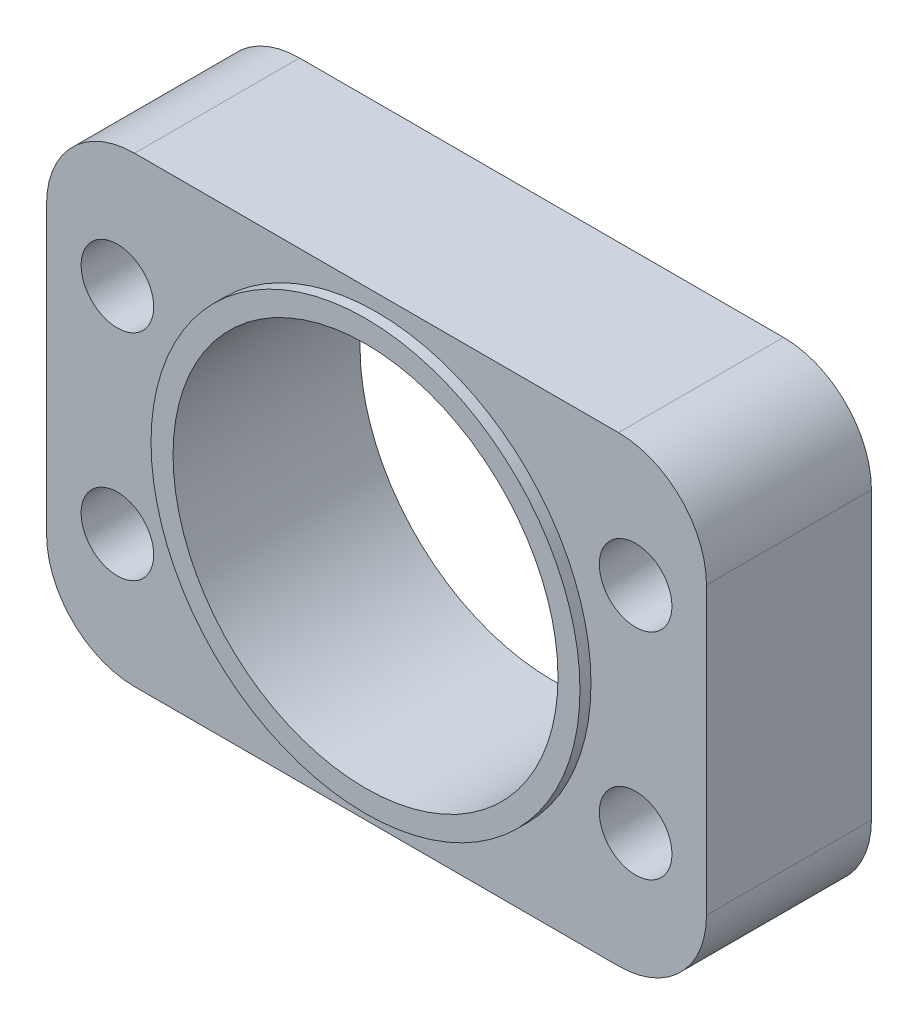
ISO-10303-21;
HEADER;
FILE_DESCRIPTION(('STEP AP214'),'2;1');
FILE_NAME('part.step','',(''),(''),'','','');
FILE_SCHEMA(('AUTOMOTIVE_DESIGN { 1 0 10303 214 1 1 1 1 }'));
ENDSEC;
DATA;
#1=APPLICATION_CONTEXT('core data for automotive mechanical design processes');
#2=APPLICATION_PROTOCOL_DEFINITION('international standard','automotive_design',2000,#1);
#3=PRODUCT_CONTEXT('',#1,'mechanical');
#4=PRODUCT('Part','Part','',(#3));
#5=PRODUCT_RELATED_PRODUCT_CATEGORY('part','',(#4));
#6=PRODUCT_DEFINITION_FORMATION('','',#4);
#7=PRODUCT_DEFINITION_CONTEXT('part definition',#1,'design');
#8=PRODUCT_DEFINITION('design','',#6,#7);
#9=PRODUCT_DEFINITION_SHAPE('','',#8);
#10=(LENGTH_UNIT() NAMED_UNIT(*) SI_UNIT(.MILLI.,.METRE.));
#11=(NAMED_UNIT(*) PLANE_ANGLE_UNIT() SI_UNIT($,.RADIAN.));
#12=(NAMED_UNIT(*) SI_UNIT($,.STERADIAN.) SOLID_ANGLE_UNIT());
#13=UNCERTAINTY_MEASURE_WITH_UNIT(LENGTH_MEASURE(1.E-05),#10,'distance_accuracy_value','');
#14=(GEOMETRIC_REPRESENTATION_CONTEXT(3) GLOBAL_UNCERTAINTY_ASSIGNED_CONTEXT((#13)) GLOBAL_UNIT_ASSIGNED_CONTEXT((#10,
#11,#12)) REPRESENTATION_CONTEXT('',''));
#15=CARTESIAN_POINT('',(0.,0.,0.));
#16=DIRECTION('',(0.,0.,1.));
#17=DIRECTION('',(1.,0.,0.));
#18=AXIS2_PLACEMENT_3D('',#15,#16,#17);
#19=CARTESIAN_POINT('',(-21.9999999999987,12.9999999999987,-15.));
#20=DIRECTION('',(0.,0.,1.));
#21=DIRECTION('',(-1.62475418465166E-13,1.,0.));
#22=AXIS2_PLACEMENT_3D('',#19,#20,#21);
#23=CYLINDRICAL_SURFACE('',#22,8.0000000000013);
#24=CARTESIAN_POINT('',(-21.9999999999987,12.9999999999987,0.));
#25=DIRECTION('',(0.,0.,-1.));
#26=DIRECTION('',(-1.,1.62536650805096E-13,0.));
#27=AXIS2_PLACEMENT_3D('',#24,#25,#26);
#28=CIRCLE('',#27,8.0000000000013);
#29=CARTESIAN_POINT('',(-22.,21.,0.));
#30=VERTEX_POINT('',#29);
#31=CARTESIAN_POINT('',(-30.,13.,0.));
#32=VERTEX_POINT('',#31);
#33=EDGE_CURVE('E83',#30,#32,#28,.F.);
#34=ORIENTED_EDGE('',*,*,#33,.F.);
#35=DIRECTION('',(0.,0.,-1.));
#36=VECTOR('',#35,1.);
#37=CARTESIAN_POINT('',(-22.,21.,0.));
#38=LINE('',#37,#36);
#39=CARTESIAN_POINT('',(-22.,21.,-15.));
#40=VERTEX_POINT('',#39);
#41=EDGE_CURVE('E95',#40,#30,#38,.F.);
#42=ORIENTED_EDGE('',*,*,#41,.F.);
#43=CARTESIAN_POINT('',(-21.9999999999987,12.9999999999987,-15.));
#44=DIRECTION('',(0.,0.,1.));
#45=DIRECTION('',(-1.62536650805096E-13,1.,0.));
#46=AXIS2_PLACEMENT_3D('',#43,#44,#45);
#47=CIRCLE('',#46,8.0000000000013);
#48=CARTESIAN_POINT('',(-30.,13.,-15.));
#49=VERTEX_POINT('',#48);
#50=EDGE_CURVE('E100',#40,#49,#47,.T.);
#51=ORIENTED_EDGE('',*,*,#50,.T.);
#52=DIRECTION('',(0.,0.,1.));
#53=VECTOR('',#52,1.);
#54=CARTESIAN_POINT('',(-30.,13.,-15.));
#55=LINE('',#54,#53);
#56=EDGE_CURVE('E97',#49,#32,#55,.T.);
#57=ORIENTED_EDGE('',*,*,#56,.T.);
#58=EDGE_LOOP('',(#34,#42,#51,#57));
#59=FACE_BOUND('',#58,.T.);
#60=ADVANCED_FACE('F17',(#59),#23,.T.);
#61=CARTESIAN_POINT('',(-30.,-13.,-15.));
#62=DIRECTION('',(-1.,0.,0.));
#63=DIRECTION('',(0.,0.,1.));
#64=AXIS2_PLACEMENT_3D('',#61,#62,#63);
#65=PLANE('',#64);
#66=DIRECTION('',(0.,1.,0.));
#67=VECTOR('',#66,1.);
#68=CARTESIAN_POINT('',(-30.,-13.,0.));
#69=LINE('',#68,#67);
#70=CARTESIAN_POINT('',(-30.,-13.,0.));
#71=VERTEX_POINT('',#70);
#72=EDGE_CURVE('E111',#32,#71,#69,.F.);
#73=ORIENTED_EDGE('',*,*,#72,.F.);
#74=ORIENTED_EDGE('',*,*,#56,.F.);
#75=DIRECTION('',(0.,-1.,0.));
#76=VECTOR('',#75,1.);
#77=CARTESIAN_POINT('',(-30.,13.,-15.));
#78=LINE('',#77,#76);
#79=CARTESIAN_POINT('',(-30.,-13.,-15.));
#80=VERTEX_POINT('',#79);
#81=EDGE_CURVE('E115',#49,#80,#78,.T.);
#82=ORIENTED_EDGE('',*,*,#81,.T.);
#83=DIRECTION('',(0.,0.,1.));
#84=VECTOR('',#83,1.);
#85=CARTESIAN_POINT('',(-30.,-13.,-15.));
#86=LINE('',#85,#84);
#87=EDGE_CURVE('E120',#80,#71,#86,.T.);
#88=ORIENTED_EDGE('',*,*,#87,.T.);
#89=EDGE_LOOP('',(#73,#74,#82,#88));
#90=FACE_BOUND('',#89,.T.);
#91=ADVANCED_FACE('F263',(#90),#65,.T.);
#92=CARTESIAN_POINT('',(-21.9999999999987,-12.9999999999987,-15.));
#93=DIRECTION('',(0.,0.,1.));
#94=DIRECTION('',(-1.,-1.61526007705508E-13,0.));
#95=AXIS2_PLACEMENT_3D('',#92,#93,#94);
#96=CYLINDRICAL_SURFACE('',#95,8.0000000000013);
#97=CARTESIAN_POINT('',(-21.9999999999987,-12.9999999999987,0.));
#98=DIRECTION('',(0.,0.,-1.));
#99=DIRECTION('',(-1.62536650805096E-13,-1.,0.));
#100=AXIS2_PLACEMENT_3D('',#97,#98,#99);
#101=CIRCLE('',#100,8.0000000000013);
#102=CARTESIAN_POINT('',(-22.,-21.,0.));
#103=VERTEX_POINT('',#102);
#104=EDGE_CURVE('E125',#71,#103,#101,.F.);
#105=ORIENTED_EDGE('',*,*,#104,.F.);
#106=ORIENTED_EDGE('',*,*,#87,.F.);
#107=CARTESIAN_POINT('',(-21.9999999999987,-12.9999999999987,-15.));
#108=DIRECTION('',(0.,0.,1.));
#109=DIRECTION('',(-1.,-1.61426427780472E-13,0.));
#110=AXIS2_PLACEMENT_3D('',#107,#108,#109);
#111=CIRCLE('',#110,8.0000000000013);
#112=CARTESIAN_POINT('',(-22.,-21.,-15.));
#113=VERTEX_POINT('',#112);
#114=EDGE_CURVE('E129',#80,#113,#111,.T.);
#115=ORIENTED_EDGE('',*,*,#114,.T.);
#116=DIRECTION('',(0.,0.,1.));
#117=VECTOR('',#116,1.);
#118=CARTESIAN_POINT('',(-22.,-21.,-15.));
#119=LINE('',#118,#117);
#120=EDGE_CURVE('E134',#113,#103,#119,.T.);
#121=ORIENTED_EDGE('',*,*,#120,.T.);
#122=EDGE_LOOP('',(#105,#106,#115,#121));
#123=FACE_BOUND('',#122,.T.);
#124=ADVANCED_FACE('F268',(#123),#96,.T.);
#125=CARTESIAN_POINT('',(-22.,-21.,0.));
#126=DIRECTION('',(0.,-1.,0.));
#127=DIRECTION('',(0.,0.,-1.));
#128=AXIS2_PLACEMENT_3D('',#125,#126,#127);
#129=PLANE('',#128);
#130=DIRECTION('',(-1.,0.,0.));
#131=VECTOR('',#130,1.);
#132=CARTESIAN_POINT('',(22.,-21.,0.));
#133=LINE('',#132,#131);
#134=CARTESIAN_POINT('',(22.,-21.,0.));
#135=VERTEX_POINT('',#134);
#136=EDGE_CURVE('E139',#103,#135,#133,.F.);
#137=ORIENTED_EDGE('',*,*,#136,.F.);
#138=ORIENTED_EDGE('',*,*,#120,.F.);
#139=DIRECTION('',(1.,0.,0.));
#140=VECTOR('',#139,1.);
#141=CARTESIAN_POINT('',(-22.,-21.,-15.));
#142=LINE('',#141,#140);
#143=CARTESIAN_POINT('',(22.,-21.,-15.));
#144=VERTEX_POINT('',#143);
#145=EDGE_CURVE('E143',#113,#144,#142,.T.);
#146=ORIENTED_EDGE('',*,*,#145,.T.);
#147=DIRECTION('',(0.,0.,1.));
#148=VECTOR('',#147,1.);
#149=CARTESIAN_POINT('',(22.,-21.,-15.));
#150=LINE('',#149,#148);
#151=EDGE_CURVE('E148',#144,#135,#150,.T.);
#152=ORIENTED_EDGE('',*,*,#151,.T.);
#153=EDGE_LOOP('',(#137,#138,#146,#152));
#154=FACE_BOUND('',#153,.T.);
#155=ADVANCED_FACE('F274',(#154),#129,.T.);
#156=CARTESIAN_POINT('',(21.9999999999987,-12.9999999999987,-15.));
#157=DIRECTION('',(0.,0.,1.));
#158=DIRECTION('',(1.62352953785251E-13,-1.,0.));
#159=AXIS2_PLACEMENT_3D('',#156,#157,#158);
#160=CYLINDRICAL_SURFACE('',#159,8.0000000000013);
#161=CARTESIAN_POINT('',(21.9999999999987,-12.9999999999987,0.));
#162=DIRECTION('',(0.,0.,-1.));
#163=DIRECTION('',(1.,0.,0.));
#164=AXIS2_PLACEMENT_3D('',#161,#162,#163);
#165=CIRCLE('',#164,8.0000000000013);
#166=CARTESIAN_POINT('',(30.,-12.9999999999993,0.));
#167=VERTEX_POINT('',#166);
#168=EDGE_CURVE('E153',#135,#167,#165,.F.);
#169=ORIENTED_EDGE('',*,*,#168,.F.);
#170=ORIENTED_EDGE('',*,*,#151,.F.);
#171=CARTESIAN_POINT('',(21.9999999999987,-12.9999999999987,-15.));
#172=DIRECTION('',(0.,0.,1.));
#173=DIRECTION('',(1.62536650805096E-13,-1.,0.));
#174=AXIS2_PLACEMENT_3D('',#171,#172,#173);
#175=CIRCLE('',#174,8.0000000000013);
#176=CARTESIAN_POINT('',(30.,-12.9999999999992,-15.));
#177=VERTEX_POINT('',#176);
#178=EDGE_CURVE('E157',#144,#177,#175,.T.);
#179=ORIENTED_EDGE('',*,*,#178,.T.);
#180=DIRECTION('',(0.,0.,1.));
#181=VECTOR('',#180,1.);
#182=CARTESIAN_POINT('',(30.,-12.9999999999992,-15.));
#183=LINE('',#182,#181);
#184=EDGE_CURVE('E162',#177,#167,#183,.T.);
#185=ORIENTED_EDGE('',*,*,#184,.T.);
#186=EDGE_LOOP('',(#169,#170,#179,#185));
#187=FACE_BOUND('',#186,.T.);
#188=ADVANCED_FACE('F278',(#187),#160,.T.);
#189=CARTESIAN_POINT('',(30.,-12.9999999999993,0.));
#190=DIRECTION('',(1.,0.,0.));
#191=DIRECTION('',(0.,0.,-1.));
#192=AXIS2_PLACEMENT_3D('',#189,#190,#191);
#193=PLANE('',#192);
#194=DIRECTION('',(0.,-1.,0.));
#195=VECTOR('',#194,1.);
#196=CARTESIAN_POINT('',(30.,12.9999999999998,0.));
#197=LINE('',#196,#195);
#198=CARTESIAN_POINT('',(30.,12.9999999999998,0.));
#199=VERTEX_POINT('',#198);
#200=EDGE_CURVE('E167',#167,#199,#197,.F.);
#201=ORIENTED_EDGE('',*,*,#200,.F.);
#202=ORIENTED_EDGE('',*,*,#184,.F.);
#203=DIRECTION('',(0.,1.,0.));
#204=VECTOR('',#203,1.);
#205=CARTESIAN_POINT('',(30.,-12.9999999999992,-15.));
#206=LINE('',#205,#204);
#207=CARTESIAN_POINT('',(30.,12.9999999999998,-15.));
#208=VERTEX_POINT('',#207);
#209=EDGE_CURVE('E171',#177,#208,#206,.T.);
#210=ORIENTED_EDGE('',*,*,#209,.T.);
#211=DIRECTION('',(0.,0.,1.));
#212=VECTOR('',#211,1.);
#213=CARTESIAN_POINT('',(30.,12.9999999999998,-15.));
#214=LINE('',#213,#212);
#215=EDGE_CURVE('E176',#208,#199,#214,.T.);
#216=ORIENTED_EDGE('',*,*,#215,.T.);
#217=EDGE_LOOP('',(#201,#202,#210,#216));
#218=FACE_BOUND('',#217,.T.);
#219=ADVANCED_FACE('F282',(#218),#193,.T.);
#220=CARTESIAN_POINT('',(21.9999999999987,12.9999999999987,-15.));
#221=DIRECTION('',(0.,0.,1.));
#222=DIRECTION('',(1.,0.,0.));
#223=AXIS2_PLACEMENT_3D('',#220,#221,#222);
#224=CYLINDRICAL_SURFACE('',#223,8.0000000000013);
#225=CARTESIAN_POINT('',(21.9999999999987,12.9999999999987,0.));
#226=DIRECTION('',(0.,0.,-1.));
#227=DIRECTION('',(1.62092561595247E-13,1.,0.));
#228=AXIS2_PLACEMENT_3D('',#225,#226,#227);
#229=CIRCLE('',#228,8.0000000000013);
#230=CARTESIAN_POINT('',(22.,21.,0.));
#231=VERTEX_POINT('',#230);
#232=EDGE_CURVE('E32',#199,#231,#229,.F.);
#233=ORIENTED_EDGE('',*,*,#232,.F.);
#234=ORIENTED_EDGE('',*,*,#215,.F.);
#235=CARTESIAN_POINT('',(21.9999999999987,12.9999999999987,-15.));
#236=DIRECTION('',(0.,0.,1.));
#237=DIRECTION('',(1.,1.38333788868272E-13,0.));
#238=AXIS2_PLACEMENT_3D('',#235,#236,#237);
#239=CIRCLE('',#238,8.0000000000013);
#240=CARTESIAN_POINT('',(22.,21.,-15.));
#241=VERTEX_POINT('',#240);
#242=EDGE_CURVE('E184',#208,#241,#239,.T.);
#243=ORIENTED_EDGE('',*,*,#242,.T.);
#244=DIRECTION('',(0.,0.,1.));
#245=VECTOR('',#244,1.);
#246=CARTESIAN_POINT('',(22.,21.,-15.));
#247=LINE('',#246,#245);
#248=EDGE_CURVE('E89',#241,#231,#247,.T.);
#249=ORIENTED_EDGE('',*,*,#248,.T.);
#250=EDGE_LOOP('',(#233,#234,#243,#249));
#251=FACE_BOUND('',#250,.T.);
#252=ADVANCED_FACE('F286',(#251),#224,.T.);
#253=CARTESIAN_POINT('',(-22.,21.,-15.));
#254=DIRECTION('',(0.,1.,0.));
#255=DIRECTION('',(0.,0.,1.));
#256=AXIS2_PLACEMENT_3D('',#253,#254,#255);
#257=PLANE('',#256);
#258=DIRECTION('',(1.,0.,0.));
#259=VECTOR('',#258,1.);
#260=CARTESIAN_POINT('',(-22.,21.,0.));
#261=LINE('',#260,#259);
#262=EDGE_CURVE('E79',#231,#30,#261,.F.);
#263=ORIENTED_EDGE('',*,*,#262,.F.);
#264=ORIENTED_EDGE('',*,*,#248,.F.);
#265=DIRECTION('',(-1.,0.,0.));
#266=VECTOR('',#265,1.);
#267=CARTESIAN_POINT('',(22.,21.,-15.));
#268=LINE('',#267,#266);
#269=EDGE_CURVE('E40',#241,#40,#268,.T.);
#270=ORIENTED_EDGE('',*,*,#269,.T.);
#271=ORIENTED_EDGE('',*,*,#41,.T.);
#272=EDGE_LOOP('',(#263,#264,#270,#271));
#273=FACE_BOUND('',#272,.T.);
#274=ADVANCED_FACE('F99',(#273),#257,.T.);
#275=CARTESIAN_POINT('',(-30.,-21.,-15.));
#276=DIRECTION('',(0.,0.,-1.));
#277=DIRECTION('',(0.,1.,0.));
#278=AXIS2_PLACEMENT_3D('',#275,#276,#277);
#279=PLANE('',#278);
#280=ORIENTED_EDGE('',*,*,#50,.F.);
#281=ORIENTED_EDGE('',*,*,#269,.F.);
#282=ORIENTED_EDGE('',*,*,#242,.F.);
#283=ORIENTED_EDGE('',*,*,#209,.F.);
#284=ORIENTED_EDGE('',*,*,#178,.F.);
#285=ORIENTED_EDGE('',*,*,#145,.F.);
#286=ORIENTED_EDGE('',*,*,#114,.F.);
#287=ORIENTED_EDGE('',*,*,#81,.F.);
#288=EDGE_LOOP('',(#280,#281,#282,#283,#284,#285,#286,#287));
#289=FACE_BOUND('',#288,.T.);
#290=CARTESIAN_POINT('',(0.,0.,-15.));
#291=DIRECTION('',(0.,0.,1.));
#292=DIRECTION('',(-1.,0.,0.));
#293=AXIS2_PLACEMENT_3D('',#290,#291,#292);
#294=CIRCLE('',#293,19.5);
#295=CARTESIAN_POINT('',(-19.5,0.,-15.));
#296=VERTEX_POINT('',#295);
#297=EDGE_CURVE('E196',#296,#296,#294,.T.);
#298=ORIENTED_EDGE('',*,*,#297,.T.);
#299=EDGE_LOOP('',(#298));
#300=FACE_BOUND('',#299,.T.);
#301=CARTESIAN_POINT('',(-23.558928079038,9.7584275253098,-15.));
#302=DIRECTION('',(0.,0.,1.));
#303=DIRECTION('',(-1.,0.,0.));
#304=AXIS2_PLACEMENT_3D('',#301,#302,#303);
#305=CIRCLE('',#304,3.3);
#306=CARTESIAN_POINT('',(-26.858928079038,9.75842752530981,-15.));
#307=VERTEX_POINT('',#306);
#308=EDGE_CURVE('E201',#307,#307,#305,.T.);
#309=ORIENTED_EDGE('',*,*,#308,.T.);
#310=EDGE_LOOP('',(#309));
#311=FACE_BOUND('',#310,.T.);
#312=CARTESIAN_POINT('',(23.558928079038,9.7584275253098,-15.));
#313=DIRECTION('',(0.,0.,1.));
#314=DIRECTION('',(-1.,0.,0.));
#315=AXIS2_PLACEMENT_3D('',#312,#313,#314);
#316=CIRCLE('',#315,3.3);
#317=CARTESIAN_POINT('',(20.258928079038,9.75842752530981,-15.));
#318=VERTEX_POINT('',#317);
#319=EDGE_CURVE('E204',#318,#318,#316,.T.);
#320=ORIENTED_EDGE('',*,*,#319,.T.);
#321=EDGE_LOOP('',(#320));
#322=FACE_BOUND('',#321,.T.);
#323=CARTESIAN_POINT('',(23.558928079038,-9.7584275253098,-15.));
#324=DIRECTION('',(0.,0.,1.));
#325=DIRECTION('',(-1.,0.,0.));
#326=AXIS2_PLACEMENT_3D('',#323,#324,#325);
#327=CIRCLE('',#326,3.3);
#328=CARTESIAN_POINT('',(20.258928079038,-9.7584275253098,-15.));
#329=VERTEX_POINT('',#328);
#330=EDGE_CURVE('E207',#329,#329,#327,.T.);
#331=ORIENTED_EDGE('',*,*,#330,.T.);
#332=EDGE_LOOP('',(#331));
#333=FACE_BOUND('',#332,.T.);
#334=CARTESIAN_POINT('',(-23.558928079038,-9.7584275253098,-15.));
#335=DIRECTION('',(0.,0.,1.));
#336=DIRECTION('',(-1.,0.,0.));
#337=AXIS2_PLACEMENT_3D('',#334,#335,#336);
#338=CIRCLE('',#337,3.3);
#339=CARTESIAN_POINT('',(-26.858928079038,-9.7584275253098,-15.));
#340=VERTEX_POINT('',#339);
#341=EDGE_CURVE('E210',#340,#340,#338,.T.);
#342=ORIENTED_EDGE('',*,*,#341,.T.);
#343=EDGE_LOOP('',(#342));
#344=FACE_BOUND('',#343,.T.);
#345=ADVANCED_FACE('F293',(#289,#300,#311,#322,#333,#344),#279,.T.);
#346=CARTESIAN_POINT('',(-30.,-21.,0.));
#347=DIRECTION('',(0.,0.,1.));
#348=DIRECTION('',(1.,0.,0.));
#349=AXIS2_PLACEMENT_3D('',#346,#347,#348);
#350=PLANE('',#349);
#351=ORIENTED_EDGE('',*,*,#33,.T.);
#352=ORIENTED_EDGE('',*,*,#72,.T.);
#353=ORIENTED_EDGE('',*,*,#104,.T.);
#354=ORIENTED_EDGE('',*,*,#136,.T.);
#355=ORIENTED_EDGE('',*,*,#168,.T.);
#356=ORIENTED_EDGE('',*,*,#200,.T.);
#357=ORIENTED_EDGE('',*,*,#232,.T.);
#358=ORIENTED_EDGE('',*,*,#262,.T.);
#359=EDGE_LOOP('',(#351,#352,#353,#354,#355,#356,#357,#358));
#360=FACE_BOUND('',#359,.T.);
#361=CARTESIAN_POINT('',(0.,0.,0.));
#362=DIRECTION('',(0.,0.,-1.));
#363=DIRECTION('',(1.,-1.16832847669894E-09,0.));
#364=AXIS2_PLACEMENT_3D('',#361,#362,#363);
#365=CIRCLE('',#364,19.5);
#366=CARTESIAN_POINT('',(19.5,-2.27824052956294E-08,0.));
#367=VERTEX_POINT('',#366);
#368=EDGE_CURVE('E213',#367,#367,#365,.F.);
#369=ORIENTED_EDGE('',*,*,#368,.F.);
#370=EDGE_LOOP('',(#369));
#371=FACE_BOUND('',#370,.T.);
#372=CARTESIAN_POINT('',(-23.558928079038,9.7584275253098,0.));
#373=DIRECTION('',(0.,0.,-1.));
#374=DIRECTION('',(1.,0.,0.));
#375=AXIS2_PLACEMENT_3D('',#372,#373,#374);
#376=CIRCLE('',#375,3.3);
#377=CARTESIAN_POINT('',(-20.258928079038,9.75842752530979,0.));
#378=VERTEX_POINT('',#377);
#379=EDGE_CURVE('E216',#378,#378,#376,.F.);
#380=ORIENTED_EDGE('',*,*,#379,.F.);
#381=EDGE_LOOP('',(#380));
#382=FACE_BOUND('',#381,.T.);
#383=CARTESIAN_POINT('',(23.558928079038,9.7584275253098,0.));
#384=DIRECTION('',(0.,0.,-1.));
#385=DIRECTION('',(1.,0.,0.));
#386=AXIS2_PLACEMENT_3D('',#383,#384,#385);
#387=CIRCLE('',#386,3.3);
#388=CARTESIAN_POINT('',(26.858928079038,9.75842752530979,0.));
#389=VERTEX_POINT('',#388);
#390=EDGE_CURVE('E219',#389,#389,#387,.F.);
#391=ORIENTED_EDGE('',*,*,#390,.F.);
#392=EDGE_LOOP('',(#391));
#393=FACE_BOUND('',#392,.T.);
#394=CARTESIAN_POINT('',(23.558928079038,-9.7584275253098,0.));
#395=DIRECTION('',(0.,0.,-1.));
#396=DIRECTION('',(1.,0.,0.));
#397=AXIS2_PLACEMENT_3D('',#394,#395,#396);
#398=CIRCLE('',#397,3.3);
#399=CARTESIAN_POINT('',(26.858928079038,-9.7584275253098,0.));
#400=VERTEX_POINT('',#399);
#401=EDGE_CURVE('E222',#400,#400,#398,.F.);
#402=ORIENTED_EDGE('',*,*,#401,.F.);
#403=EDGE_LOOP('',(#402));
#404=FACE_BOUND('',#403,.T.);
#405=CARTESIAN_POINT('',(-23.558928079038,-9.7584275253098,0.));
#406=DIRECTION('',(0.,0.,-1.));
#407=DIRECTION('',(1.,0.,0.));
#408=AXIS2_PLACEMENT_3D('',#405,#406,#407);
#409=CIRCLE('',#408,3.3);
#410=CARTESIAN_POINT('',(-20.258928079038,-9.7584275253098,0.));
#411=VERTEX_POINT('',#410);
#412=EDGE_CURVE('E225',#411,#411,#409,.F.);
#413=ORIENTED_EDGE('',*,*,#412,.F.);
#414=EDGE_LOOP('',(#413));
#415=FACE_BOUND('',#414,.T.);
#416=ADVANCED_FACE('F81',(#360,#371,#382,#393,#404,#415),#350,.T.);
#417=CARTESIAN_POINT('',(-19.5,-19.8622387029843,1.));
#418=DIRECTION('',(0.,0.,1.));
#419=DIRECTION('',(1.,0.,0.));
#420=AXIS2_PLACEMENT_3D('',#417,#418,#419);
#421=PLANE('',#420);
#422=CARTESIAN_POINT('',(0.,0.,1.));
#423=DIRECTION('',(0.,0.,1.));
#424=DIRECTION('',(-1.,0.,0.));
#425=AXIS2_PLACEMENT_3D('',#422,#423,#424);
#426=CIRCLE('',#425,19.5);
#427=CARTESIAN_POINT('',(-19.5,0.,1.));
#428=VERTEX_POINT('',#427);
#429=EDGE_CURVE('E228',#428,#428,#426,.T.);
#430=ORIENTED_EDGE('',*,*,#429,.T.);
#431=EDGE_LOOP('',(#430));
#432=FACE_BOUND('',#431,.T.);
#433=CARTESIAN_POINT('',(0.,0.,1.));
#434=DIRECTION('',(0.,0.,-1.));
#435=DIRECTION('',(1.,0.,0.));
#436=AXIS2_PLACEMENT_3D('',#433,#434,#435);
#437=CIRCLE('',#436,17.5);
#438=CARTESIAN_POINT('',(17.5,0.,1.));
#439=VERTEX_POINT('',#438);
#440=EDGE_CURVE('E231',#439,#439,#437,.F.);
#441=ORIENTED_EDGE('',*,*,#440,.F.);
#442=EDGE_LOOP('',(#441));
#443=FACE_BOUND('',#442,.T.);
#444=ADVANCED_FACE('F242',(#432,#443),#421,.T.);
#445=CARTESIAN_POINT('',(-19.5,-19.8622386915074,-16.));
#446=DIRECTION('',(0.,0.,-1.));
#447=DIRECTION('',(0.,1.,0.));
#448=AXIS2_PLACEMENT_3D('',#445,#446,#447);
#449=PLANE('',#448);
#450=CARTESIAN_POINT('',(0.,0.,-16.));
#451=DIRECTION('',(0.,0.,-1.));
#452=DIRECTION('',(1.,0.,0.));
#453=AXIS2_PLACEMENT_3D('',#450,#451,#452);
#454=CIRCLE('',#453,19.5);
#455=CARTESIAN_POINT('',(19.5,0.,-16.));
#456=VERTEX_POINT('',#455);
#457=EDGE_CURVE('E25',#456,#456,#454,.F.);
#458=ORIENTED_EDGE('',*,*,#457,.F.);
#459=EDGE_LOOP('',(#458));
#460=FACE_BOUND('',#459,.T.);
#461=CARTESIAN_POINT('',(0.,0.,-16.));
#462=DIRECTION('',(0.,0.,1.));
#463=DIRECTION('',(-1.,0.,0.));
#464=AXIS2_PLACEMENT_3D('',#461,#462,#463);
#465=CIRCLE('',#464,17.5);
#466=CARTESIAN_POINT('',(-17.5,0.,-16.));
#467=VERTEX_POINT('',#466);
#468=EDGE_CURVE('E11',#467,#467,#465,.T.);
#469=ORIENTED_EDGE('',*,*,#468,.T.);
#470=EDGE_LOOP('',(#469));
#471=FACE_BOUND('',#470,.T.);
#472=ADVANCED_FACE('F238',(#460,#471),#449,.T.);
#473=CARTESIAN_POINT('',(23.558928079038,-9.7584275253098,-15.));
#474=DIRECTION('',(0.,0.,1.));
#475=DIRECTION('',(-1.,0.,0.));
#476=AXIS2_PLACEMENT_3D('',#473,#474,#475);
#477=CYLINDRICAL_SURFACE('',#476,3.3);
#478=ORIENTED_EDGE('',*,*,#330,.F.);
#479=EDGE_LOOP('',(#478));
#480=FACE_BOUND('',#479,.T.);
#481=ORIENTED_EDGE('',*,*,#401,.T.);
#482=EDGE_LOOP('',(#481));
#483=FACE_BOUND('',#482,.T.);
#484=ADVANCED_FACE('F241',(#480,#483),#477,.F.);
#485=CARTESIAN_POINT('',(23.558928079038,9.7584275253098,-15.));
#486=DIRECTION('',(0.,0.,1.));
#487=DIRECTION('',(-1.,0.,0.));
#488=AXIS2_PLACEMENT_3D('',#485,#486,#487);
#489=CYLINDRICAL_SURFACE('',#488,3.3);
#490=ORIENTED_EDGE('',*,*,#319,.F.);
#491=EDGE_LOOP('',(#490));
#492=FACE_BOUND('',#491,.T.);
#493=ORIENTED_EDGE('',*,*,#390,.T.);
#494=EDGE_LOOP('',(#493));
#495=FACE_BOUND('',#494,.T.);
#496=ADVANCED_FACE('F249',(#492,#495),#489,.F.);
#497=CARTESIAN_POINT('',(0.,0.,-15.));
#498=DIRECTION('',(0.,0.,1.));
#499=DIRECTION('',(-1.,1.1685342807892E-09,0.));
#500=AXIS2_PLACEMENT_3D('',#497,#498,#499);
#501=CYLINDRICAL_SURFACE('',#500,17.5);
#502=ORIENTED_EDGE('',*,*,#440,.T.);
#503=EDGE_LOOP('',(#502));
#504=FACE_BOUND('',#503,.T.);
#505=ORIENTED_EDGE('',*,*,#468,.F.);
#506=EDGE_LOOP('',(#505));
#507=FACE_BOUND('',#506,.T.);
#508=ADVANCED_FACE('F246',(#504,#507),#501,.F.);
#509=CARTESIAN_POINT('',(-23.558928079038,9.7584275253098,-15.));
#510=DIRECTION('',(0.,0.,1.));
#511=DIRECTION('',(-1.,0.,0.));
#512=AXIS2_PLACEMENT_3D('',#509,#510,#511);
#513=CYLINDRICAL_SURFACE('',#512,3.3);
#514=ORIENTED_EDGE('',*,*,#308,.F.);
#515=EDGE_LOOP('',(#514));
#516=FACE_BOUND('',#515,.T.);
#517=ORIENTED_EDGE('',*,*,#379,.T.);
#518=EDGE_LOOP('',(#517));
#519=FACE_BOUND('',#518,.T.);
#520=ADVANCED_FACE('F248',(#516,#519),#513,.F.);
#521=CARTESIAN_POINT('',(-23.558928079038,-9.7584275253098,-15.));
#522=DIRECTION('',(0.,0.,1.));
#523=DIRECTION('',(-1.,0.,0.));
#524=AXIS2_PLACEMENT_3D('',#521,#522,#523);
#525=CYLINDRICAL_SURFACE('',#524,3.3);
#526=ORIENTED_EDGE('',*,*,#341,.F.);
#527=EDGE_LOOP('',(#526));
#528=FACE_BOUND('',#527,.T.);
#529=ORIENTED_EDGE('',*,*,#412,.T.);
#530=EDGE_LOOP('',(#529));
#531=FACE_BOUND('',#530,.T.);
#532=ADVANCED_FACE('F257',(#528,#531),#525,.F.);
#533=CARTESIAN_POINT('',(0.,0.,1.));
#534=DIRECTION('',(0.,0.,-1.));
#535=DIRECTION('',(1.,0.,0.));
#536=AXIS2_PLACEMENT_3D('',#533,#534,#535);
#537=CYLINDRICAL_SURFACE('',#536,19.5);
#538=ORIENTED_EDGE('',*,*,#429,.F.);
#539=EDGE_LOOP('',(#538));
#540=FACE_BOUND('',#539,.T.);
#541=ORIENTED_EDGE('',*,*,#368,.T.);
#542=EDGE_LOOP('',(#541));
#543=FACE_BOUND('',#542,.T.);
#544=ADVANCED_FACE('F313',(#540,#543),#537,.T.);
#545=CARTESIAN_POINT('',(0.,0.,-16.));
#546=DIRECTION('',(0.,0.,1.));
#547=DIRECTION('',(-1.,1.16847876963797E-09,0.));
#548=AXIS2_PLACEMENT_3D('',#545,#546,#547);
#549=CYLINDRICAL_SURFACE('',#548,19.5);
#550=ORIENTED_EDGE('',*,*,#457,.T.);
#551=EDGE_LOOP('',(#550));
#552=FACE_BOUND('',#551,.T.);
#553=ORIENTED_EDGE('',*,*,#297,.F.);
#554=EDGE_LOOP('',(#553));
#555=FACE_BOUND('',#554,.T.);
#556=ADVANCED_FACE('F19',(#552,#555),#549,.T.);
#557=CLOSED_SHELL('',(#60,#91,#124,#155,#188,#219,#252,#274,#345,#416,#444,#472,#484,#496,#508,
#520,#532,#544,#556));
#558=MANIFOLD_SOLID_BREP('B1',#557);
#559=ADVANCED_BREP_SHAPE_REPRESENTATION('',(#18,#558),#14);
#560=SHAPE_DEFINITION_REPRESENTATION(#9,#559);
ENDSEC;
END-ISO-10303-21;
